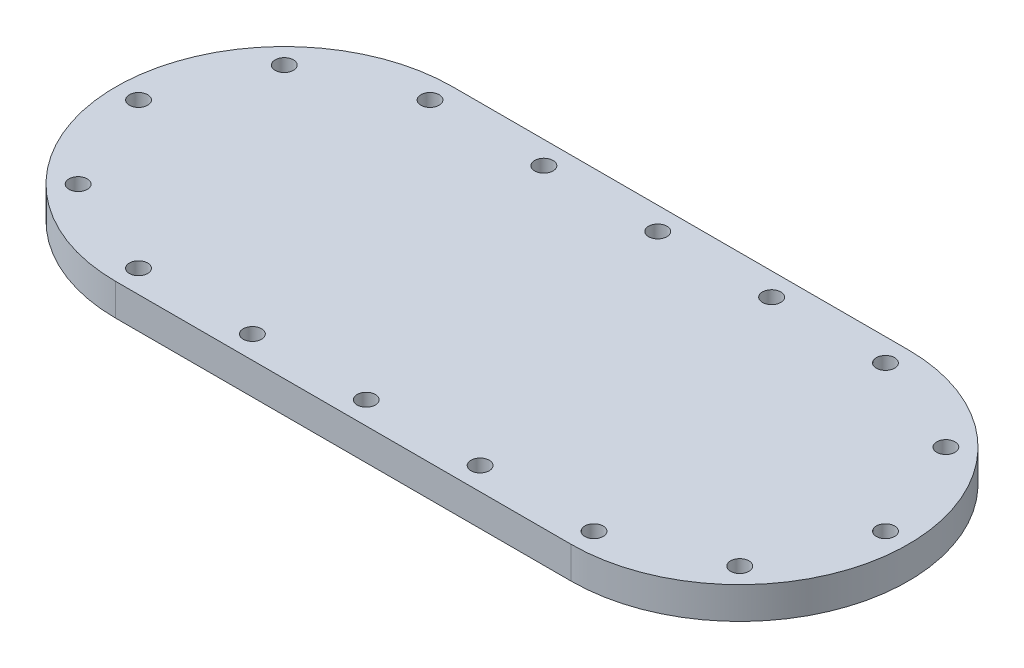
ISO-10303-21;
HEADER;
FILE_DESCRIPTION(('STEP AP214'),'2;1');
FILE_NAME('part.step','',(''),(''),'','','');
FILE_SCHEMA(('AUTOMOTIVE_DESIGN { 1 0 10303 214 1 1 1 1 }'));
ENDSEC;
DATA;
#1=APPLICATION_CONTEXT('core data for automotive mechanical design processes');
#2=APPLICATION_PROTOCOL_DEFINITION('international standard','automotive_design',2000,#1);
#3=PRODUCT_CONTEXT('',#1,'mechanical');
#4=PRODUCT('Part','Part','',(#3));
#5=PRODUCT_RELATED_PRODUCT_CATEGORY('part','',(#4));
#6=PRODUCT_DEFINITION_FORMATION('','',#4);
#7=PRODUCT_DEFINITION_CONTEXT('part definition',#1,'design');
#8=PRODUCT_DEFINITION('design','',#6,#7);
#9=PRODUCT_DEFINITION_SHAPE('','',#8);
#10=(LENGTH_UNIT() NAMED_UNIT(*) SI_UNIT(.MILLI.,.METRE.));
#11=(NAMED_UNIT(*) PLANE_ANGLE_UNIT() SI_UNIT($,.RADIAN.));
#12=(NAMED_UNIT(*) SI_UNIT($,.STERADIAN.) SOLID_ANGLE_UNIT());
#13=UNCERTAINTY_MEASURE_WITH_UNIT(LENGTH_MEASURE(1.E-05),#10,'distance_accuracy_value','');
#14=(GEOMETRIC_REPRESENTATION_CONTEXT(3) GLOBAL_UNCERTAINTY_ASSIGNED_CONTEXT((#13)) GLOBAL_UNIT_ASSIGNED_CONTEXT((#10,
#11,#12)) REPRESENTATION_CONTEXT('',''));
#15=CARTESIAN_POINT('',(0.,0.,0.));
#16=DIRECTION('',(0.,0.,1.));
#17=DIRECTION('',(1.,0.,0.));
#18=AXIS2_PLACEMENT_3D('',#15,#16,#17);
#19=CARTESIAN_POINT('',(0.,8.89,-46.99));
#20=DIRECTION('',(0.,0.,-1.));
#21=DIRECTION('',(-1.,0.,0.));
#22=AXIS2_PLACEMENT_3D('',#19,#20,#21);
#23=PLANE('',#22);
#24=DIRECTION('',(1.,0.,0.));
#25=VECTOR('',#24,1.);
#26=CARTESIAN_POINT('',(0.,0.,-46.99));
#27=LINE('',#26,#25);
#28=CARTESIAN_POINT('',(-63.5,0.,-46.99));
#29=VERTEX_POINT('',#28);
#30=CARTESIAN_POINT('',(63.5,0.,-46.99));
#31=VERTEX_POINT('',#30);
#32=EDGE_CURVE('E109',#29,#31,#27,.T.);
#33=ORIENTED_EDGE('',*,*,#32,.F.);
#34=DIRECTION('',(0.,-1.,0.));
#35=VECTOR('',#34,1.);
#36=CARTESIAN_POINT('',(-63.5,8.89,-46.99));
#37=LINE('',#36,#35);
#38=CARTESIAN_POINT('',(-63.5,8.89,-46.99));
#39=VERTEX_POINT('',#38);
#40=EDGE_CURVE('E11',#39,#29,#37,.T.);
#41=ORIENTED_EDGE('',*,*,#40,.F.);
#42=DIRECTION('',(1.,0.,0.));
#43=VECTOR('',#42,1.);
#44=CARTESIAN_POINT('',(0.,8.89,-46.99));
#45=LINE('',#44,#43);
#46=CARTESIAN_POINT('',(63.5,8.89,-46.99));
#47=VERTEX_POINT('',#46);
#48=EDGE_CURVE('E95',#39,#47,#45,.T.);
#49=ORIENTED_EDGE('',*,*,#48,.T.);
#50=DIRECTION('',(0.,-1.,0.));
#51=VECTOR('',#50,1.);
#52=CARTESIAN_POINT('',(63.5,8.89,-46.99));
#53=LINE('',#52,#51);
#54=EDGE_CURVE('E77',#47,#31,#53,.T.);
#55=ORIENTED_EDGE('',*,*,#54,.T.);
#56=EDGE_LOOP('',(#33,#41,#49,#55));
#57=FACE_BOUND('',#56,.T.);
#58=ADVANCED_FACE('F38',(#57),#23,.T.);
#59=CARTESIAN_POINT('',(-63.5,8.89,0.));
#60=DIRECTION('',(0.,-1.,0.));
#61=DIRECTION('',(0.,0.,-1.));
#62=AXIS2_PLACEMENT_3D('',#59,#60,#61);
#63=CYLINDRICAL_SURFACE('',#62,46.99);
#64=CARTESIAN_POINT('',(-63.5,0.,0.));
#65=DIRECTION('',(0.,1.,0.));
#66=DIRECTION('',(0.,0.,1.));
#67=AXIS2_PLACEMENT_3D('',#64,#65,#66);
#68=CIRCLE('',#67,46.99);
#69=CARTESIAN_POINT('',(-63.5,0.,46.99));
#70=VERTEX_POINT('',#69);
#71=EDGE_CURVE('E100',#29,#70,#68,.T.);
#72=ORIENTED_EDGE('',*,*,#71,.T.);
#73=DIRECTION('',(0.,-1.,0.));
#74=VECTOR('',#73,1.);
#75=CARTESIAN_POINT('',(-63.5,8.89,46.99));
#76=LINE('',#75,#74);
#77=CARTESIAN_POINT('',(-63.5,8.89,46.99));
#78=VERTEX_POINT('',#77);
#79=EDGE_CURVE('E47',#78,#70,#76,.T.);
#80=ORIENTED_EDGE('',*,*,#79,.F.);
#81=CARTESIAN_POINT('',(-63.5,8.89,0.));
#82=DIRECTION('',(0.,1.,0.));
#83=DIRECTION('',(0.,0.,1.));
#84=AXIS2_PLACEMENT_3D('',#81,#82,#83);
#85=CIRCLE('',#84,46.99);
#86=EDGE_CURVE('E92',#39,#78,#85,.T.);
#87=ORIENTED_EDGE('',*,*,#86,.F.);
#88=ORIENTED_EDGE('',*,*,#40,.T.);
#89=EDGE_LOOP('',(#72,#80,#87,#88));
#90=FACE_BOUND('',#89,.T.);
#91=ADVANCED_FACE('F98',(#90),#63,.T.);
#92=CARTESIAN_POINT('',(0.,8.89,46.99));
#93=DIRECTION('',(0.,0.,-1.));
#94=DIRECTION('',(-1.,0.,0.));
#95=AXIS2_PLACEMENT_3D('',#92,#93,#94);
#96=PLANE('',#95);
#97=DIRECTION('',(1.,0.,0.));
#98=VECTOR('',#97,1.);
#99=CARTESIAN_POINT('',(0.,0.,46.99));
#100=LINE('',#99,#98);
#101=CARTESIAN_POINT('',(63.5,0.,46.99));
#102=VERTEX_POINT('',#101);
#103=EDGE_CURVE('E106',#70,#102,#100,.T.);
#104=ORIENTED_EDGE('',*,*,#103,.T.);
#105=DIRECTION('',(0.,-1.,0.));
#106=VECTOR('',#105,1.);
#107=CARTESIAN_POINT('',(63.5,8.89,46.99));
#108=LINE('',#107,#106);
#109=CARTESIAN_POINT('',(63.5,8.89,46.99));
#110=VERTEX_POINT('',#109);
#111=EDGE_CURVE('E91',#110,#102,#108,.T.);
#112=ORIENTED_EDGE('',*,*,#111,.F.);
#113=DIRECTION('',(1.,0.,0.));
#114=VECTOR('',#113,1.);
#115=CARTESIAN_POINT('',(0.,8.89,46.99));
#116=LINE('',#115,#114);
#117=EDGE_CURVE('E85',#78,#110,#116,.T.);
#118=ORIENTED_EDGE('',*,*,#117,.F.);
#119=ORIENTED_EDGE('',*,*,#79,.T.);
#120=EDGE_LOOP('',(#104,#112,#118,#119));
#121=FACE_BOUND('',#120,.T.);
#122=ADVANCED_FACE('F88',(#121),#96,.F.);
#123=CARTESIAN_POINT('',(-63.5,8.89,-40.64));
#124=DIRECTION('',(0.,-1.,0.));
#125=DIRECTION('',(0.,0.,-1.));
#126=AXIS2_PLACEMENT_3D('',#123,#124,#125);
#127=CYLINDRICAL_SURFACE('',#126,2.5527);
#128=CARTESIAN_POINT('',(-63.5,8.89,-40.64));
#129=DIRECTION('',(0.,1.,0.));
#130=DIRECTION('',(0.,0.,1.));
#131=AXIS2_PLACEMENT_3D('',#128,#129,#130);
#132=CIRCLE('',#131,2.5527);
#133=CARTESIAN_POINT('',(-63.5,8.89,-38.0873));
#134=VERTEX_POINT('',#133);
#135=EDGE_CURVE('E161',#134,#134,#132,.T.);
#136=ORIENTED_EDGE('',*,*,#135,.T.);
#137=EDGE_LOOP('',(#136));
#138=FACE_BOUND('',#137,.T.);
#139=CARTESIAN_POINT('',(-63.5,0.,-40.64));
#140=DIRECTION('',(0.,1.,0.));
#141=DIRECTION('',(0.,0.,1.));
#142=AXIS2_PLACEMENT_3D('',#139,#140,#141);
#143=CIRCLE('',#142,2.5527);
#144=CARTESIAN_POINT('',(-63.5,0.,-38.0873));
#145=VERTEX_POINT('',#144);
#146=EDGE_CURVE('E111',#145,#145,#143,.T.);
#147=ORIENTED_EDGE('',*,*,#146,.F.);
#148=EDGE_LOOP('',(#147));
#149=FACE_BOUND('',#148,.T.);
#150=ADVANCED_FACE('F246',(#138,#149),#127,.F.);
#151=CARTESIAN_POINT('',(-31.7499999999999,8.89,-40.64));
#152=DIRECTION('',(0.,-1.,0.));
#153=DIRECTION('',(0.,0.,-1.));
#154=AXIS2_PLACEMENT_3D('',#151,#152,#153);
#155=CYLINDRICAL_SURFACE('',#154,2.5527);
#156=CARTESIAN_POINT('',(-31.7499999999999,8.89,-40.64));
#157=DIRECTION('',(0.,1.,0.));
#158=DIRECTION('',(0.,0.,1.));
#159=AXIS2_PLACEMENT_3D('',#156,#157,#158);
#160=CIRCLE('',#159,2.5527);
#161=CARTESIAN_POINT('',(-31.7499999999999,8.89,-38.0873));
#162=VERTEX_POINT('',#161);
#163=EDGE_CURVE('E164',#162,#162,#160,.T.);
#164=ORIENTED_EDGE('',*,*,#163,.T.);
#165=EDGE_LOOP('',(#164));
#166=FACE_BOUND('',#165,.T.);
#167=CARTESIAN_POINT('',(-31.7499999999999,0.,-40.64));
#168=DIRECTION('',(0.,1.,0.));
#169=DIRECTION('',(0.,0.,1.));
#170=AXIS2_PLACEMENT_3D('',#167,#168,#169);
#171=CIRCLE('',#170,2.5527);
#172=CARTESIAN_POINT('',(-31.7499999999999,0.,-38.0873));
#173=VERTEX_POINT('',#172);
#174=EDGE_CURVE('E114',#173,#173,#171,.T.);
#175=ORIENTED_EDGE('',*,*,#174,.F.);
#176=EDGE_LOOP('',(#175));
#177=FACE_BOUND('',#176,.T.);
#178=ADVANCED_FACE('F249',(#166,#177),#155,.F.);
#179=CARTESIAN_POINT('',(0.,8.89,-40.64));
#180=DIRECTION('',(0.,-1.,0.));
#181=DIRECTION('',(0.,0.,-1.));
#182=AXIS2_PLACEMENT_3D('',#179,#180,#181);
#183=CYLINDRICAL_SURFACE('',#182,2.5527);
#184=CARTESIAN_POINT('',(0.,8.89,-40.64));
#185=DIRECTION('',(0.,1.,0.));
#186=DIRECTION('',(0.,0.,1.));
#187=AXIS2_PLACEMENT_3D('',#184,#185,#186);
#188=CIRCLE('',#187,2.5527);
#189=CARTESIAN_POINT('',(0.,8.89,-38.0873));
#190=VERTEX_POINT('',#189);
#191=EDGE_CURVE('E167',#190,#190,#188,.T.);
#192=ORIENTED_EDGE('',*,*,#191,.T.);
#193=EDGE_LOOP('',(#192));
#194=FACE_BOUND('',#193,.T.);
#195=CARTESIAN_POINT('',(0.,0.,-40.64));
#196=DIRECTION('',(0.,1.,0.));
#197=DIRECTION('',(0.,0.,1.));
#198=AXIS2_PLACEMENT_3D('',#195,#196,#197);
#199=CIRCLE('',#198,2.5527);
#200=CARTESIAN_POINT('',(0.,0.,-38.0873));
#201=VERTEX_POINT('',#200);
#202=EDGE_CURVE('E117',#201,#201,#199,.T.);
#203=ORIENTED_EDGE('',*,*,#202,.F.);
#204=EDGE_LOOP('',(#203));
#205=FACE_BOUND('',#204,.T.);
#206=ADVANCED_FACE('F266',(#194,#205),#183,.F.);
#207=CARTESIAN_POINT('',(31.7500000000001,8.89,-40.64));
#208=DIRECTION('',(0.,-1.,0.));
#209=DIRECTION('',(0.,0.,-1.));
#210=AXIS2_PLACEMENT_3D('',#207,#208,#209);
#211=CYLINDRICAL_SURFACE('',#210,2.5527);
#212=CARTESIAN_POINT('',(31.7500000000001,8.89,-40.64));
#213=DIRECTION('',(0.,1.,0.));
#214=DIRECTION('',(0.,0.,1.));
#215=AXIS2_PLACEMENT_3D('',#212,#213,#214);
#216=CIRCLE('',#215,2.5527);
#217=CARTESIAN_POINT('',(31.7500000000001,8.89,-38.0873));
#218=VERTEX_POINT('',#217);
#219=EDGE_CURVE('E170',#218,#218,#216,.T.);
#220=ORIENTED_EDGE('',*,*,#219,.T.);
#221=EDGE_LOOP('',(#220));
#222=FACE_BOUND('',#221,.T.);
#223=CARTESIAN_POINT('',(31.7500000000001,0.,-40.64));
#224=DIRECTION('',(0.,1.,0.));
#225=DIRECTION('',(0.,0.,1.));
#226=AXIS2_PLACEMENT_3D('',#223,#224,#225);
#227=CIRCLE('',#226,2.5527);
#228=CARTESIAN_POINT('',(31.7500000000001,0.,-38.0873));
#229=VERTEX_POINT('',#228);
#230=EDGE_CURVE('E120',#229,#229,#227,.T.);
#231=ORIENTED_EDGE('',*,*,#230,.F.);
#232=EDGE_LOOP('',(#231));
#233=FACE_BOUND('',#232,.T.);
#234=ADVANCED_FACE('F270',(#222,#233),#211,.F.);
#235=CARTESIAN_POINT('',(63.5000000000001,8.89,-40.64));
#236=DIRECTION('',(0.,-1.,0.));
#237=DIRECTION('',(0.,0.,-1.));
#238=AXIS2_PLACEMENT_3D('',#235,#236,#237);
#239=CYLINDRICAL_SURFACE('',#238,2.5527);
#240=CARTESIAN_POINT('',(63.5000000000001,8.89,-40.64));
#241=DIRECTION('',(0.,1.,0.));
#242=DIRECTION('',(0.,0.,1.));
#243=AXIS2_PLACEMENT_3D('',#240,#241,#242);
#244=CIRCLE('',#243,2.5527);
#245=CARTESIAN_POINT('',(63.5000000000001,8.89,-38.0873));
#246=VERTEX_POINT('',#245);
#247=EDGE_CURVE('E173',#246,#246,#244,.T.);
#248=ORIENTED_EDGE('',*,*,#247,.T.);
#249=EDGE_LOOP('',(#248));
#250=FACE_BOUND('',#249,.T.);
#251=CARTESIAN_POINT('',(63.5000000000001,0.,-40.64));
#252=DIRECTION('',(0.,1.,0.));
#253=DIRECTION('',(0.,0.,1.));
#254=AXIS2_PLACEMENT_3D('',#251,#252,#253);
#255=CIRCLE('',#254,2.5527);
#256=CARTESIAN_POINT('',(63.5000000000001,0.,-38.0873));
#257=VERTEX_POINT('',#256);
#258=EDGE_CURVE('E123',#257,#257,#255,.T.);
#259=ORIENTED_EDGE('',*,*,#258,.F.);
#260=EDGE_LOOP('',(#259));
#261=FACE_BOUND('',#260,.T.);
#262=ADVANCED_FACE('F274',(#250,#261),#239,.F.);
#263=CARTESIAN_POINT('',(92.2368195874217,8.89,-28.7368195874219));
#264=DIRECTION('',(0.,-1.,0.));
#265=DIRECTION('',(0.,0.,-1.));
#266=AXIS2_PLACEMENT_3D('',#263,#264,#265);
#267=CYLINDRICAL_SURFACE('',#266,2.5527);
#268=CARTESIAN_POINT('',(92.2368195874217,8.89,-28.7368195874219));
#269=DIRECTION('',(0.,1.,0.));
#270=DIRECTION('',(0.,0.,1.));
#271=AXIS2_PLACEMENT_3D('',#268,#269,#270);
#272=CIRCLE('',#271,2.5527);
#273=CARTESIAN_POINT('',(92.2368195874217,8.89,-26.1841195874219));
#274=VERTEX_POINT('',#273);
#275=EDGE_CURVE('E176',#274,#274,#272,.T.);
#276=ORIENTED_EDGE('',*,*,#275,.T.);
#277=EDGE_LOOP('',(#276));
#278=FACE_BOUND('',#277,.T.);
#279=CARTESIAN_POINT('',(92.2368195874217,0.,-28.7368195874219));
#280=DIRECTION('',(0.,1.,0.));
#281=DIRECTION('',(0.,0.,1.));
#282=AXIS2_PLACEMENT_3D('',#279,#280,#281);
#283=CIRCLE('',#282,2.5527);
#284=CARTESIAN_POINT('',(92.2368195874217,0.,-26.1841195874219));
#285=VERTEX_POINT('',#284);
#286=EDGE_CURVE('E126',#285,#285,#283,.T.);
#287=ORIENTED_EDGE('',*,*,#286,.F.);
#288=EDGE_LOOP('',(#287));
#289=FACE_BOUND('',#288,.T.);
#290=ADVANCED_FACE('F278',(#278,#289),#267,.F.);
#291=CARTESIAN_POINT('',(104.140000000001,8.89,-9.15933995315754E-13));
#292=DIRECTION('',(0.,-1.,0.));
#293=DIRECTION('',(0.,0.,-1.));
#294=AXIS2_PLACEMENT_3D('',#291,#292,#293);
#295=CYLINDRICAL_SURFACE('',#294,2.5527);
#296=CARTESIAN_POINT('',(104.140000000001,8.89,-9.15933995315754E-13));
#297=DIRECTION('',(0.,1.,0.));
#298=DIRECTION('',(0.,0.,1.));
#299=AXIS2_PLACEMENT_3D('',#296,#297,#298);
#300=CIRCLE('',#299,2.5527);
#301=CARTESIAN_POINT('',(104.140000000001,8.89,2.55269999999908));
#302=VERTEX_POINT('',#301);
#303=EDGE_CURVE('E179',#302,#302,#300,.T.);
#304=ORIENTED_EDGE('',*,*,#303,.T.);
#305=EDGE_LOOP('',(#304));
#306=FACE_BOUND('',#305,.T.);
#307=CARTESIAN_POINT('',(104.140000000001,0.,-9.15933995315754E-13));
#308=DIRECTION('',(0.,1.,0.));
#309=DIRECTION('',(0.,0.,1.));
#310=AXIS2_PLACEMENT_3D('',#307,#308,#309);
#311=CIRCLE('',#310,2.5527);
#312=CARTESIAN_POINT('',(104.140000000001,0.,2.55269999999908));
#313=VERTEX_POINT('',#312);
#314=EDGE_CURVE('E129',#313,#313,#311,.T.);
#315=ORIENTED_EDGE('',*,*,#314,.F.);
#316=EDGE_LOOP('',(#315));
#317=FACE_BOUND('',#316,.T.);
#318=ADVANCED_FACE('F282',(#306,#317),#295,.F.);
#319=CARTESIAN_POINT('',(92.236819587423,8.89,28.7368195874207));
#320=DIRECTION('',(0.,-1.,0.));
#321=DIRECTION('',(0.,0.,-1.));
#322=AXIS2_PLACEMENT_3D('',#319,#320,#321);
#323=CYLINDRICAL_SURFACE('',#322,2.5527);
#324=CARTESIAN_POINT('',(92.236819587423,8.89,28.7368195874207));
#325=DIRECTION('',(0.,1.,0.));
#326=DIRECTION('',(0.,0.,1.));
#327=AXIS2_PLACEMENT_3D('',#324,#325,#326);
#328=CIRCLE('',#327,2.5527);
#329=CARTESIAN_POINT('',(92.236819587423,8.89,31.2895195874207));
#330=VERTEX_POINT('',#329);
#331=EDGE_CURVE('E182',#330,#330,#328,.T.);
#332=ORIENTED_EDGE('',*,*,#331,.T.);
#333=EDGE_LOOP('',(#332));
#334=FACE_BOUND('',#333,.T.);
#335=CARTESIAN_POINT('',(92.236819587423,0.,28.7368195874207));
#336=DIRECTION('',(0.,1.,0.));
#337=DIRECTION('',(0.,0.,1.));
#338=AXIS2_PLACEMENT_3D('',#335,#336,#337);
#339=CIRCLE('',#338,2.5527);
#340=CARTESIAN_POINT('',(92.236819587423,0.,31.2895195874207));
#341=VERTEX_POINT('',#340);
#342=EDGE_CURVE('E132',#341,#341,#339,.T.);
#343=ORIENTED_EDGE('',*,*,#342,.F.);
#344=EDGE_LOOP('',(#343));
#345=FACE_BOUND('',#344,.T.);
#346=ADVANCED_FACE('F286',(#334,#345),#323,.F.);
#347=CARTESIAN_POINT('',(63.500000000002,8.89,40.64));
#348=DIRECTION('',(0.,-1.,0.));
#349=DIRECTION('',(0.,0.,-1.));
#350=AXIS2_PLACEMENT_3D('',#347,#348,#349);
#351=CYLINDRICAL_SURFACE('',#350,2.5527);
#352=CARTESIAN_POINT('',(63.500000000002,8.89,40.64));
#353=DIRECTION('',(0.,1.,0.));
#354=DIRECTION('',(0.,0.,1.));
#355=AXIS2_PLACEMENT_3D('',#352,#353,#354);
#356=CIRCLE('',#355,2.5527);
#357=CARTESIAN_POINT('',(63.500000000002,8.89,43.1927));
#358=VERTEX_POINT('',#357);
#359=EDGE_CURVE('E185',#358,#358,#356,.T.);
#360=ORIENTED_EDGE('',*,*,#359,.T.);
#361=EDGE_LOOP('',(#360));
#362=FACE_BOUND('',#361,.T.);
#363=CARTESIAN_POINT('',(63.500000000002,0.,40.64));
#364=DIRECTION('',(0.,1.,0.));
#365=DIRECTION('',(0.,0.,1.));
#366=AXIS2_PLACEMENT_3D('',#363,#364,#365);
#367=CIRCLE('',#366,2.5527);
#368=CARTESIAN_POINT('',(63.500000000002,0.,43.1927));
#369=VERTEX_POINT('',#368);
#370=EDGE_CURVE('E135',#369,#369,#367,.T.);
#371=ORIENTED_EDGE('',*,*,#370,.F.);
#372=EDGE_LOOP('',(#371));
#373=FACE_BOUND('',#372,.T.);
#374=ADVANCED_FACE('F290',(#362,#373),#351,.F.);
#375=CARTESIAN_POINT('',(-92.2368195874208,8.89,-28.7368195874203));
#376=DIRECTION('',(0.,-1.,0.));
#377=DIRECTION('',(0.,0.,-1.));
#378=AXIS2_PLACEMENT_3D('',#375,#376,#377);
#379=CYLINDRICAL_SURFACE('',#378,2.55270000000001);
#380=CARTESIAN_POINT('',(-92.2368195874208,8.89,-28.7368195874203));
#381=DIRECTION('',(0.,1.,0.));
#382=DIRECTION('',(0.,0.,1.));
#383=AXIS2_PLACEMENT_3D('',#380,#381,#382);
#384=CIRCLE('',#383,2.55270000000001);
#385=CARTESIAN_POINT('',(-92.2368195874208,8.89,-26.1841195874203));
#386=VERTEX_POINT('',#385);
#387=EDGE_CURVE('E188',#386,#386,#384,.T.);
#388=ORIENTED_EDGE('',*,*,#387,.T.);
#389=EDGE_LOOP('',(#388));
#390=FACE_BOUND('',#389,.T.);
#391=CARTESIAN_POINT('',(-92.2368195874208,0.,-28.7368195874203));
#392=DIRECTION('',(0.,1.,0.));
#393=DIRECTION('',(0.,0.,1.));
#394=AXIS2_PLACEMENT_3D('',#391,#392,#393);
#395=CIRCLE('',#394,2.55270000000001);
#396=CARTESIAN_POINT('',(-92.2368195874208,0.,-26.1841195874203));
#397=VERTEX_POINT('',#396);
#398=EDGE_CURVE('E138',#397,#397,#395,.T.);
#399=ORIENTED_EDGE('',*,*,#398,.F.);
#400=EDGE_LOOP('',(#399));
#401=FACE_BOUND('',#400,.T.);
#402=ADVANCED_FACE('F294',(#390,#401),#379,.F.);
#403=CARTESIAN_POINT('',(-104.139999999999,8.89,1.38777878078145E-12));
#404=DIRECTION('',(0.,-1.,0.));
#405=DIRECTION('',(0.,0.,-1.));
#406=AXIS2_PLACEMENT_3D('',#403,#404,#405);
#407=CYLINDRICAL_SURFACE('',#406,2.55270000000001);
#408=CARTESIAN_POINT('',(-104.139999999999,8.89,1.38777878078145E-12));
#409=DIRECTION('',(0.,1.,0.));
#410=DIRECTION('',(0.,0.,1.));
#411=AXIS2_PLACEMENT_3D('',#408,#409,#410);
#412=CIRCLE('',#411,2.55270000000001);
#413=CARTESIAN_POINT('',(-104.139999999999,8.89,2.5527000000014));
#414=VERTEX_POINT('',#413);
#415=EDGE_CURVE('E191',#414,#414,#412,.T.);
#416=ORIENTED_EDGE('',*,*,#415,.T.);
#417=EDGE_LOOP('',(#416));
#418=FACE_BOUND('',#417,.T.);
#419=CARTESIAN_POINT('',(-104.139999999999,0.,1.38777878078145E-12));
#420=DIRECTION('',(0.,1.,0.));
#421=DIRECTION('',(0.,0.,1.));
#422=AXIS2_PLACEMENT_3D('',#419,#420,#421);
#423=CIRCLE('',#422,2.55270000000001);
#424=CARTESIAN_POINT('',(-104.139999999999,0.,2.5527000000014));
#425=VERTEX_POINT('',#424);
#426=EDGE_CURVE('E141',#425,#425,#423,.T.);
#427=ORIENTED_EDGE('',*,*,#426,.F.);
#428=EDGE_LOOP('',(#427));
#429=FACE_BOUND('',#428,.T.);
#430=ADVANCED_FACE('F298',(#418,#429),#407,.F.);
#431=CARTESIAN_POINT('',(-92.2368195874189,8.89,28.7368195874223));
#432=DIRECTION('',(0.,-1.,0.));
#433=DIRECTION('',(0.,0.,-1.));
#434=AXIS2_PLACEMENT_3D('',#431,#432,#433);
#435=CYLINDRICAL_SURFACE('',#434,2.5527);
#436=CARTESIAN_POINT('',(-92.2368195874189,8.89,28.7368195874223));
#437=DIRECTION('',(0.,1.,0.));
#438=DIRECTION('',(0.,0.,1.));
#439=AXIS2_PLACEMENT_3D('',#436,#437,#438);
#440=CIRCLE('',#439,2.5527);
#441=CARTESIAN_POINT('',(-92.2368195874189,8.89,31.2895195874223));
#442=VERTEX_POINT('',#441);
#443=EDGE_CURVE('E194',#442,#442,#440,.T.);
#444=ORIENTED_EDGE('',*,*,#443,.T.);
#445=EDGE_LOOP('',(#444));
#446=FACE_BOUND('',#445,.T.);
#447=CARTESIAN_POINT('',(-92.2368195874189,0.,28.7368195874223));
#448=DIRECTION('',(0.,1.,0.));
#449=DIRECTION('',(0.,0.,1.));
#450=AXIS2_PLACEMENT_3D('',#447,#448,#449);
#451=CIRCLE('',#450,2.5527);
#452=CARTESIAN_POINT('',(-92.2368195874189,0.,31.2895195874223));
#453=VERTEX_POINT('',#452);
#454=EDGE_CURVE('E144',#453,#453,#451,.T.);
#455=ORIENTED_EDGE('',*,*,#454,.F.);
#456=EDGE_LOOP('',(#455));
#457=FACE_BOUND('',#456,.T.);
#458=ADVANCED_FACE('F302',(#446,#457),#435,.F.);
#459=CARTESIAN_POINT('',(-63.4999999999972,8.89,40.64));
#460=DIRECTION('',(0.,-1.,0.));
#461=DIRECTION('',(0.,0.,-1.));
#462=AXIS2_PLACEMENT_3D('',#459,#460,#461);
#463=CYLINDRICAL_SURFACE('',#462,2.5527);
#464=CARTESIAN_POINT('',(-63.4999999999972,8.89,40.64));
#465=DIRECTION('',(0.,1.,0.));
#466=DIRECTION('',(0.,0.,1.));
#467=AXIS2_PLACEMENT_3D('',#464,#465,#466);
#468=CIRCLE('',#467,2.5527);
#469=CARTESIAN_POINT('',(-63.4999999999972,8.89,43.1927));
#470=VERTEX_POINT('',#469);
#471=EDGE_CURVE('E197',#470,#470,#468,.T.);
#472=ORIENTED_EDGE('',*,*,#471,.T.);
#473=EDGE_LOOP('',(#472));
#474=FACE_BOUND('',#473,.T.);
#475=CARTESIAN_POINT('',(-63.4999999999972,0.,40.64));
#476=DIRECTION('',(0.,1.,0.));
#477=DIRECTION('',(0.,0.,1.));
#478=AXIS2_PLACEMENT_3D('',#475,#476,#477);
#479=CIRCLE('',#478,2.5527);
#480=CARTESIAN_POINT('',(-63.4999999999972,0.,43.1927));
#481=VERTEX_POINT('',#480);
#482=EDGE_CURVE('E147',#481,#481,#479,.T.);
#483=ORIENTED_EDGE('',*,*,#482,.F.);
#484=EDGE_LOOP('',(#483));
#485=FACE_BOUND('',#484,.T.);
#486=ADVANCED_FACE('F306',(#474,#485),#463,.F.);
#487=CARTESIAN_POINT('',(31.750000000002,8.89,40.6400000000002));
#488=DIRECTION('',(0.,-1.,0.));
#489=DIRECTION('',(0.,0.,-1.));
#490=AXIS2_PLACEMENT_3D('',#487,#488,#489);
#491=CYLINDRICAL_SURFACE('',#490,2.5527);
#492=CARTESIAN_POINT('',(31.750000000002,8.89,40.6400000000002));
#493=DIRECTION('',(0.,1.,0.));
#494=DIRECTION('',(0.,0.,1.));
#495=AXIS2_PLACEMENT_3D('',#492,#493,#494);
#496=CIRCLE('',#495,2.5527);
#497=CARTESIAN_POINT('',(31.750000000002,8.89,43.1927000000003));
#498=VERTEX_POINT('',#497);
#499=EDGE_CURVE('E200',#498,#498,#496,.T.);
#500=ORIENTED_EDGE('',*,*,#499,.T.);
#501=EDGE_LOOP('',(#500));
#502=FACE_BOUND('',#501,.T.);
#503=CARTESIAN_POINT('',(31.750000000002,0.,40.6400000000002));
#504=DIRECTION('',(0.,1.,0.));
#505=DIRECTION('',(0.,0.,1.));
#506=AXIS2_PLACEMENT_3D('',#503,#504,#505);
#507=CIRCLE('',#506,2.5527);
#508=CARTESIAN_POINT('',(31.750000000002,0.,43.1927000000003));
#509=VERTEX_POINT('',#508);
#510=EDGE_CURVE('E150',#509,#509,#507,.T.);
#511=ORIENTED_EDGE('',*,*,#510,.F.);
#512=EDGE_LOOP('',(#511));
#513=FACE_BOUND('',#512,.T.);
#514=ADVANCED_FACE('F310',(#502,#513),#491,.F.);
#515=CARTESIAN_POINT('',(1.95676808090184E-12,8.89,40.6400000000005));
#516=DIRECTION('',(0.,-1.,0.));
#517=DIRECTION('',(0.,0.,-1.));
#518=AXIS2_PLACEMENT_3D('',#515,#516,#517);
#519=CYLINDRICAL_SURFACE('',#518,2.5527);
#520=CARTESIAN_POINT('',(1.95676808090184E-12,8.89,40.6400000000005));
#521=DIRECTION('',(0.,1.,0.));
#522=DIRECTION('',(0.,0.,1.));
#523=AXIS2_PLACEMENT_3D('',#520,#521,#522);
#524=CIRCLE('',#523,2.5527);
#525=CARTESIAN_POINT('',(1.95676808090184E-12,8.89,43.1927000000005));
#526=VERTEX_POINT('',#525);
#527=EDGE_CURVE('E203',#526,#526,#524,.T.);
#528=ORIENTED_EDGE('',*,*,#527,.T.);
#529=EDGE_LOOP('',(#528));
#530=FACE_BOUND('',#529,.T.);
#531=CARTESIAN_POINT('',(1.95676808090184E-12,0.,40.6400000000005));
#532=DIRECTION('',(0.,1.,0.));
#533=DIRECTION('',(0.,0.,1.));
#534=AXIS2_PLACEMENT_3D('',#531,#532,#533);
#535=CIRCLE('',#534,2.5527);
#536=CARTESIAN_POINT('',(1.95676808090184E-12,0.,43.1927000000005));
#537=VERTEX_POINT('',#536);
#538=EDGE_CURVE('E153',#537,#537,#535,.T.);
#539=ORIENTED_EDGE('',*,*,#538,.F.);
#540=EDGE_LOOP('',(#539));
#541=FACE_BOUND('',#540,.T.);
#542=ADVANCED_FACE('F313',(#530,#541),#519,.F.);
#543=CARTESIAN_POINT('',(-31.749999999998,8.89,40.6400000000007));
#544=DIRECTION('',(0.,-1.,0.));
#545=DIRECTION('',(0.,0.,-1.));
#546=AXIS2_PLACEMENT_3D('',#543,#544,#545);
#547=CYLINDRICAL_SURFACE('',#546,2.55269999999999);
#548=CARTESIAN_POINT('',(-31.749999999998,8.89,40.6400000000007));
#549=DIRECTION('',(0.,1.,0.));
#550=DIRECTION('',(0.,0.,1.));
#551=AXIS2_PLACEMENT_3D('',#548,#549,#550);
#552=CIRCLE('',#551,2.55269999999999);
#553=CARTESIAN_POINT('',(-31.749999999998,8.89,43.1927000000007));
#554=VERTEX_POINT('',#553);
#555=EDGE_CURVE('E105',#554,#554,#552,.T.);
#556=ORIENTED_EDGE('',*,*,#555,.T.);
#557=EDGE_LOOP('',(#556));
#558=FACE_BOUND('',#557,.T.);
#559=CARTESIAN_POINT('',(-31.749999999998,0.,40.6400000000007));
#560=DIRECTION('',(0.,1.,0.));
#561=DIRECTION('',(0.,0.,1.));
#562=AXIS2_PLACEMENT_3D('',#559,#560,#561);
#563=CIRCLE('',#562,2.55269999999999);
#564=CARTESIAN_POINT('',(-31.749999999998,0.,43.1927000000007));
#565=VERTEX_POINT('',#564);
#566=EDGE_CURVE('E156',#565,#565,#563,.T.);
#567=ORIENTED_EDGE('',*,*,#566,.F.);
#568=EDGE_LOOP('',(#567));
#569=FACE_BOUND('',#568,.T.);
#570=ADVANCED_FACE('F40',(#558,#569),#547,.F.);
#571=CARTESIAN_POINT('',(63.5,8.89,0.));
#572=DIRECTION('',(0.,-1.,0.));
#573=DIRECTION('',(0.,0.,-1.));
#574=AXIS2_PLACEMENT_3D('',#571,#572,#573);
#575=CYLINDRICAL_SURFACE('',#574,46.99);
#576=CARTESIAN_POINT('',(63.5,0.,0.));
#577=DIRECTION('',(0.,1.,0.));
#578=DIRECTION('',(0.,0.,1.));
#579=AXIS2_PLACEMENT_3D('',#576,#577,#578);
#580=CIRCLE('',#579,46.99);
#581=EDGE_CURVE('E70',#102,#31,#580,.T.);
#582=ORIENTED_EDGE('',*,*,#581,.T.);
#583=ORIENTED_EDGE('',*,*,#54,.F.);
#584=CARTESIAN_POINT('',(63.5,8.89,0.));
#585=DIRECTION('',(0.,1.,0.));
#586=DIRECTION('',(0.,0.,1.));
#587=AXIS2_PLACEMENT_3D('',#584,#585,#586);
#588=CIRCLE('',#587,46.99);
#589=EDGE_CURVE('E55',#110,#47,#588,.T.);
#590=ORIENTED_EDGE('',*,*,#589,.F.);
#591=ORIENTED_EDGE('',*,*,#111,.T.);
#592=EDGE_LOOP('',(#582,#583,#590,#591));
#593=FACE_BOUND('',#592,.T.);
#594=ADVANCED_FACE('F214',(#593),#575,.T.);
#595=CARTESIAN_POINT('',(0.,8.89,0.));
#596=DIRECTION('',(0.,1.,0.));
#597=DIRECTION('',(0.,0.,1.));
#598=AXIS2_PLACEMENT_3D('',#595,#596,#597);
#599=PLANE('',#598);
#600=ORIENTED_EDGE('',*,*,#555,.F.);
#601=EDGE_LOOP('',(#600));
#602=FACE_BOUND('',#601,.T.);
#603=ORIENTED_EDGE('',*,*,#527,.F.);
#604=EDGE_LOOP('',(#603));
#605=FACE_BOUND('',#604,.T.);
#606=ORIENTED_EDGE('',*,*,#499,.F.);
#607=EDGE_LOOP('',(#606));
#608=FACE_BOUND('',#607,.T.);
#609=ORIENTED_EDGE('',*,*,#471,.F.);
#610=EDGE_LOOP('',(#609));
#611=FACE_BOUND('',#610,.T.);
#612=ORIENTED_EDGE('',*,*,#443,.F.);
#613=EDGE_LOOP('',(#612));
#614=FACE_BOUND('',#613,.T.);
#615=ORIENTED_EDGE('',*,*,#415,.F.);
#616=EDGE_LOOP('',(#615));
#617=FACE_BOUND('',#616,.T.);
#618=ORIENTED_EDGE('',*,*,#387,.F.);
#619=EDGE_LOOP('',(#618));
#620=FACE_BOUND('',#619,.T.);
#621=ORIENTED_EDGE('',*,*,#359,.F.);
#622=EDGE_LOOP('',(#621));
#623=FACE_BOUND('',#622,.T.);
#624=ORIENTED_EDGE('',*,*,#331,.F.);
#625=EDGE_LOOP('',(#624));
#626=FACE_BOUND('',#625,.T.);
#627=ORIENTED_EDGE('',*,*,#303,.F.);
#628=EDGE_LOOP('',(#627));
#629=FACE_BOUND('',#628,.T.);
#630=ORIENTED_EDGE('',*,*,#275,.F.);
#631=EDGE_LOOP('',(#630));
#632=FACE_BOUND('',#631,.T.);
#633=ORIENTED_EDGE('',*,*,#247,.F.);
#634=EDGE_LOOP('',(#633));
#635=FACE_BOUND('',#634,.T.);
#636=ORIENTED_EDGE('',*,*,#219,.F.);
#637=EDGE_LOOP('',(#636));
#638=FACE_BOUND('',#637,.T.);
#639=ORIENTED_EDGE('',*,*,#191,.F.);
#640=EDGE_LOOP('',(#639));
#641=FACE_BOUND('',#640,.T.);
#642=ORIENTED_EDGE('',*,*,#163,.F.);
#643=EDGE_LOOP('',(#642));
#644=FACE_BOUND('',#643,.T.);
#645=ORIENTED_EDGE('',*,*,#135,.F.);
#646=EDGE_LOOP('',(#645));
#647=FACE_BOUND('',#646,.T.);
#648=ORIENTED_EDGE('',*,*,#48,.F.);
#649=ORIENTED_EDGE('',*,*,#86,.T.);
#650=ORIENTED_EDGE('',*,*,#117,.T.);
#651=ORIENTED_EDGE('',*,*,#589,.T.);
#652=EDGE_LOOP('',(#648,#649,#650,#651));
#653=FACE_BOUND('',#652,.T.);
#654=ADVANCED_FACE('F94',(#602,#605,#608,#611,#614,#617,#620,#623,#626,#629,#632,#635,#638,#641,
#644,#647,#653),#599,.T.);
#655=CARTESIAN_POINT('',(0.,0.,0.));
#656=DIRECTION('',(0.,1.,0.));
#657=DIRECTION('',(0.,0.,1.));
#658=AXIS2_PLACEMENT_3D('',#655,#656,#657);
#659=PLANE('',#658);
#660=ORIENTED_EDGE('',*,*,#566,.T.);
#661=EDGE_LOOP('',(#660));
#662=FACE_BOUND('',#661,.T.);
#663=ORIENTED_EDGE('',*,*,#538,.T.);
#664=EDGE_LOOP('',(#663));
#665=FACE_BOUND('',#664,.T.);
#666=ORIENTED_EDGE('',*,*,#510,.T.);
#667=EDGE_LOOP('',(#666));
#668=FACE_BOUND('',#667,.T.);
#669=ORIENTED_EDGE('',*,*,#482,.T.);
#670=EDGE_LOOP('',(#669));
#671=FACE_BOUND('',#670,.T.);
#672=ORIENTED_EDGE('',*,*,#454,.T.);
#673=EDGE_LOOP('',(#672));
#674=FACE_BOUND('',#673,.T.);
#675=ORIENTED_EDGE('',*,*,#426,.T.);
#676=EDGE_LOOP('',(#675));
#677=FACE_BOUND('',#676,.T.);
#678=ORIENTED_EDGE('',*,*,#398,.T.);
#679=EDGE_LOOP('',(#678));
#680=FACE_BOUND('',#679,.T.);
#681=ORIENTED_EDGE('',*,*,#370,.T.);
#682=EDGE_LOOP('',(#681));
#683=FACE_BOUND('',#682,.T.);
#684=ORIENTED_EDGE('',*,*,#342,.T.);
#685=EDGE_LOOP('',(#684));
#686=FACE_BOUND('',#685,.T.);
#687=ORIENTED_EDGE('',*,*,#314,.T.);
#688=EDGE_LOOP('',(#687));
#689=FACE_BOUND('',#688,.T.);
#690=ORIENTED_EDGE('',*,*,#286,.T.);
#691=EDGE_LOOP('',(#690));
#692=FACE_BOUND('',#691,.T.);
#693=ORIENTED_EDGE('',*,*,#258,.T.);
#694=EDGE_LOOP('',(#693));
#695=FACE_BOUND('',#694,.T.);
#696=ORIENTED_EDGE('',*,*,#230,.T.);
#697=EDGE_LOOP('',(#696));
#698=FACE_BOUND('',#697,.T.);
#699=ORIENTED_EDGE('',*,*,#202,.T.);
#700=EDGE_LOOP('',(#699));
#701=FACE_BOUND('',#700,.T.);
#702=ORIENTED_EDGE('',*,*,#174,.T.);
#703=EDGE_LOOP('',(#702));
#704=FACE_BOUND('',#703,.T.);
#705=ORIENTED_EDGE('',*,*,#146,.T.);
#706=EDGE_LOOP('',(#705));
#707=FACE_BOUND('',#706,.T.);
#708=ORIENTED_EDGE('',*,*,#32,.T.);
#709=ORIENTED_EDGE('',*,*,#581,.F.);
#710=ORIENTED_EDGE('',*,*,#103,.F.);
#711=ORIENTED_EDGE('',*,*,#71,.F.);
#712=EDGE_LOOP('',(#708,#709,#710,#711));
#713=FACE_BOUND('',#712,.T.);
#714=ADVANCED_FACE('F213',(#662,#665,#668,#671,#674,#677,#680,#683,#686,#689,#692,#695,#698,
#701,#704,#707,#713),#659,.F.);
#715=CLOSED_SHELL('',(#58,#91,#122,#150,#178,#206,#234,#262,#290,#318,#346,#374,#402,#430,#458,
#486,#514,#542,#570,#594,#654,#714));
#716=MANIFOLD_SOLID_BREP('B2',#715);
#717=ADVANCED_BREP_SHAPE_REPRESENTATION('',(#18,#716),#14);
#718=SHAPE_DEFINITION_REPRESENTATION(#9,#717);
ENDSEC;
END-ISO-10303-21;
